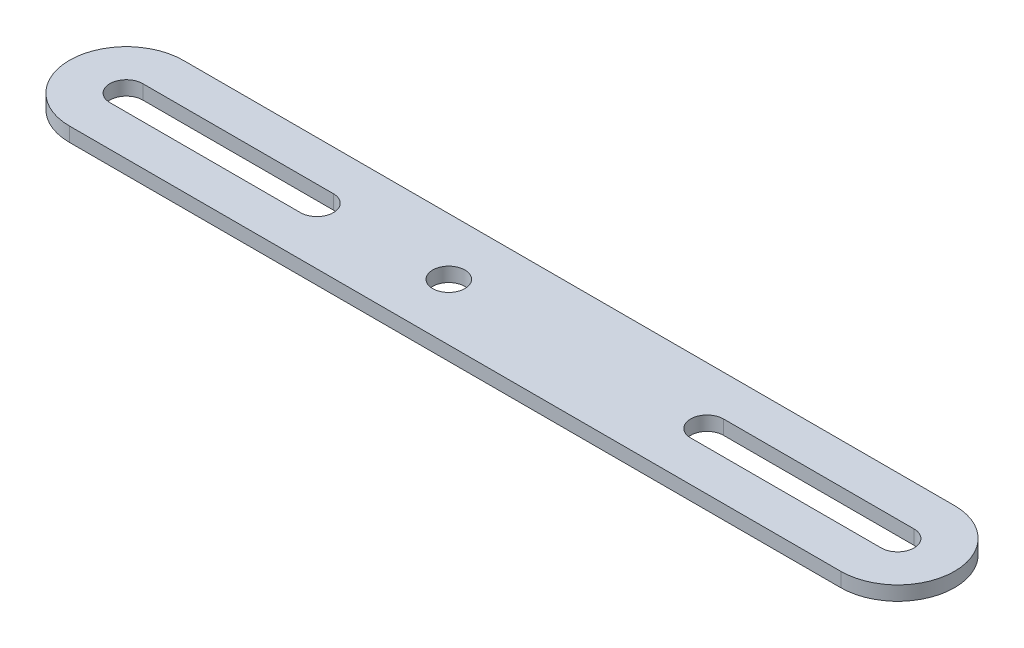
ISO-10303-21;
HEADER;
FILE_DESCRIPTION(('STEP AP214'),'2;1');
FILE_NAME('part.step','',(''),(''),'','','');
FILE_SCHEMA(('AUTOMOTIVE_DESIGN { 1 0 10303 214 1 1 1 1 }'));
ENDSEC;
DATA;
#1=APPLICATION_CONTEXT('core data for automotive mechanical design processes');
#2=APPLICATION_PROTOCOL_DEFINITION('international standard','automotive_design',2000,#1);
#3=PRODUCT_CONTEXT('',#1,'mechanical');
#4=PRODUCT('Part','Part','',(#3));
#5=PRODUCT_RELATED_PRODUCT_CATEGORY('part','',(#4));
#6=PRODUCT_DEFINITION_FORMATION('','',#4);
#7=PRODUCT_DEFINITION_CONTEXT('part definition',#1,'design');
#8=PRODUCT_DEFINITION('design','',#6,#7);
#9=PRODUCT_DEFINITION_SHAPE('','',#8);
#10=(LENGTH_UNIT() NAMED_UNIT(*) SI_UNIT(.MILLI.,.METRE.));
#11=(NAMED_UNIT(*) PLANE_ANGLE_UNIT() SI_UNIT($,.RADIAN.));
#12=(NAMED_UNIT(*) SI_UNIT($,.STERADIAN.) SOLID_ANGLE_UNIT());
#13=UNCERTAINTY_MEASURE_WITH_UNIT(LENGTH_MEASURE(1.E-05),#10,'distance_accuracy_value','');
#14=(GEOMETRIC_REPRESENTATION_CONTEXT(3) GLOBAL_UNCERTAINTY_ASSIGNED_CONTEXT((#13)) GLOBAL_UNIT_ASSIGNED_CONTEXT((#10,
#11,#12)) REPRESENTATION_CONTEXT('',''));
#15=CARTESIAN_POINT('',(0.,0.,0.));
#16=DIRECTION('',(0.,0.,1.));
#17=DIRECTION('',(1.,0.,0.));
#18=AXIS2_PLACEMENT_3D('',#15,#16,#17);
#19=CARTESIAN_POINT('',(-61.,2.25,0.));
#20=DIRECTION('',(0.,1.,0.));
#21=DIRECTION('',(0.,0.,1.));
#22=AXIS2_PLACEMENT_3D('',#19,#20,#21);
#23=PLANE('',#22);
#24=DIRECTION('',(-1.,0.,0.));
#25=VECTOR('',#24,1.);
#26=CARTESIAN_POINT('',(61.,2.25,-2.59999999999998));
#27=LINE('',#26,#25);
#28=CARTESIAN_POINT('',(61.,2.25,-2.59999999999998));
#29=VERTEX_POINT('',#28);
#30=CARTESIAN_POINT('',(30.85,2.25,-2.6));
#31=VERTEX_POINT('',#30);
#32=EDGE_CURVE('E142',#29,#31,#27,.T.);
#33=ORIENTED_EDGE('',*,*,#32,.F.);
#34=CARTESIAN_POINT('',(61.,2.25,0.));
#35=DIRECTION('',(0.,1.,0.));
#36=DIRECTION('',(0.,0.,1.));
#37=AXIS2_PLACEMENT_3D('',#34,#35,#36);
#38=CIRCLE('',#37,2.6);
#39=CARTESIAN_POINT('',(61.,2.25,2.60000000000002));
#40=VERTEX_POINT('',#39);
#41=EDGE_CURVE('E133',#40,#29,#38,.T.);
#42=ORIENTED_EDGE('',*,*,#41,.F.);
#43=DIRECTION('',(1.,0.,0.));
#44=VECTOR('',#43,1.);
#45=CARTESIAN_POINT('',(61.,2.25,2.60000000000002));
#46=LINE('',#45,#44);
#47=CARTESIAN_POINT('',(30.85,2.25,2.60000000000002));
#48=VERTEX_POINT('',#47);
#49=EDGE_CURVE('E160',#48,#40,#46,.T.);
#50=ORIENTED_EDGE('',*,*,#49,.F.);
#51=CARTESIAN_POINT('',(30.85,2.25,0.));
#52=DIRECTION('',(0.,1.,0.));
#53=DIRECTION('',(0.,0.,1.));
#54=AXIS2_PLACEMENT_3D('',#51,#52,#53);
#55=CIRCLE('',#54,2.60000000000002);
#56=EDGE_CURVE('E156',#31,#48,#55,.T.);
#57=ORIENTED_EDGE('',*,*,#56,.F.);
#58=EDGE_LOOP('',(#33,#42,#50,#57));
#59=FACE_BOUND('',#58,.T.);
#60=DIRECTION('',(1.,0.,0.));
#61=VECTOR('',#60,1.);
#62=CARTESIAN_POINT('',(-61.,2.25,2.60000000000002));
#63=LINE('',#62,#61);
#64=CARTESIAN_POINT('',(-61.,2.25,2.60000000000002));
#65=VERTEX_POINT('',#64);
#66=CARTESIAN_POINT('',(-30.85,2.25,2.60000000000005));
#67=VERTEX_POINT('',#66);
#68=EDGE_CURVE('E187',#65,#67,#63,.T.);
#69=ORIENTED_EDGE('',*,*,#68,.F.);
#70=CARTESIAN_POINT('',(-61.,2.25,0.));
#71=DIRECTION('',(0.,1.,0.));
#72=DIRECTION('',(0.,0.,1.));
#73=AXIS2_PLACEMENT_3D('',#70,#71,#72);
#74=CIRCLE('',#73,2.6);
#75=CARTESIAN_POINT('',(-61.,2.25,-2.59999999999998));
#76=VERTEX_POINT('',#75);
#77=EDGE_CURVE('E184',#76,#65,#74,.T.);
#78=ORIENTED_EDGE('',*,*,#77,.F.);
#79=DIRECTION('',(-1.,0.,0.));
#80=VECTOR('',#79,1.);
#81=CARTESIAN_POINT('',(-61.,2.25,-2.59999999999998));
#82=LINE('',#81,#80);
#83=CARTESIAN_POINT('',(-30.85,2.25,-2.60000000000002));
#84=VERTEX_POINT('',#83);
#85=EDGE_CURVE('E195',#84,#76,#82,.T.);
#86=ORIENTED_EDGE('',*,*,#85,.F.);
#87=CARTESIAN_POINT('',(-30.85,2.25,0.));
#88=DIRECTION('',(0.,1.,0.));
#89=DIRECTION('',(0.,0.,1.));
#90=AXIS2_PLACEMENT_3D('',#87,#88,#89);
#91=CIRCLE('',#90,2.60000000000002);
#92=EDGE_CURVE('E191',#67,#84,#91,.T.);
#93=ORIENTED_EDGE('',*,*,#92,.F.);
#94=EDGE_LOOP('',(#69,#78,#86,#93));
#95=FACE_BOUND('',#94,.T.);
#96=CARTESIAN_POINT('',(-61.,2.25,0.));
#97=DIRECTION('',(0.,1.,0.));
#98=DIRECTION('',(0.,0.,1.));
#99=AXIS2_PLACEMENT_3D('',#96,#97,#98);
#100=CIRCLE('',#99,8.99999999999998);
#101=CARTESIAN_POINT('',(-61.,2.25,-8.99999999999998));
#102=VERTEX_POINT('',#101);
#103=CARTESIAN_POINT('',(-61.,2.25,8.99999999999998));
#104=VERTEX_POINT('',#103);
#105=EDGE_CURVE('E227',#102,#104,#100,.T.);
#106=ORIENTED_EDGE('',*,*,#105,.T.);
#107=DIRECTION('',(1.,0.,0.));
#108=VECTOR('',#107,1.);
#109=CARTESIAN_POINT('',(-61.,2.25,8.99999999999998));
#110=LINE('',#109,#108);
#111=CARTESIAN_POINT('',(61.,2.25,9.));
#112=VERTEX_POINT('',#111);
#113=EDGE_CURVE('E231',#104,#112,#110,.T.);
#114=ORIENTED_EDGE('',*,*,#113,.T.);
#115=CARTESIAN_POINT('',(61.,2.25,0.));
#116=DIRECTION('',(0.,1.,0.));
#117=DIRECTION('',(0.,0.,1.));
#118=AXIS2_PLACEMENT_3D('',#115,#116,#117);
#119=CIRCLE('',#118,8.99999999999998);
#120=CARTESIAN_POINT('',(61.,2.25,-8.99999999999998));
#121=VERTEX_POINT('',#120);
#122=EDGE_CURVE('E235',#112,#121,#119,.T.);
#123=ORIENTED_EDGE('',*,*,#122,.T.);
#124=DIRECTION('',(-1.,0.,0.));
#125=VECTOR('',#124,1.);
#126=CARTESIAN_POINT('',(-61.,2.25,-8.99999999999998));
#127=LINE('',#126,#125);
#128=EDGE_CURVE('E238',#121,#102,#127,.T.);
#129=ORIENTED_EDGE('',*,*,#128,.T.);
#130=EDGE_LOOP('',(#106,#114,#123,#129));
#131=FACE_BOUND('',#130,.T.);
#132=CARTESIAN_POINT('',(-10.,2.25,0.));
#133=DIRECTION('',(0.,1.,0.));
#134=DIRECTION('',(0.,0.,1.));
#135=AXIS2_PLACEMENT_3D('',#132,#133,#134);
#136=CIRCLE('',#135,2.55);
#137=CARTESIAN_POINT('',(-10.,2.25,2.55));
#138=VERTEX_POINT('',#137);
#139=EDGE_CURVE('E168',#138,#138,#136,.T.);
#140=ORIENTED_EDGE('',*,*,#139,.F.);
#141=EDGE_LOOP('',(#140));
#142=FACE_BOUND('',#141,.T.);
#143=ADVANCED_FACE('F43',(#59,#95,#131,#142),#23,.T.);
#144=CARTESIAN_POINT('',(-61.,0.,0.));
#145=DIRECTION('',(0.,1.,0.));
#146=DIRECTION('',(0.,0.,1.));
#147=AXIS2_PLACEMENT_3D('',#144,#145,#146);
#148=PLANE('',#147);
#149=CARTESIAN_POINT('',(-61.,0.,0.));
#150=DIRECTION('',(0.,1.,0.));
#151=DIRECTION('',(0.,0.,1.));
#152=AXIS2_PLACEMENT_3D('',#149,#150,#151);
#153=CIRCLE('',#152,2.6);
#154=CARTESIAN_POINT('',(-61.,0.,-2.59999999999998));
#155=VERTEX_POINT('',#154);
#156=CARTESIAN_POINT('',(-61.,0.,2.60000000000002));
#157=VERTEX_POINT('',#156);
#158=EDGE_CURVE('E151',#155,#157,#153,.T.);
#159=ORIENTED_EDGE('',*,*,#158,.T.);
#160=DIRECTION('',(1.,0.,0.));
#161=VECTOR('',#160,1.);
#162=CARTESIAN_POINT('',(-61.,0.,2.60000000000002));
#163=LINE('',#162,#161);
#164=CARTESIAN_POINT('',(-30.85,0.,2.60000000000005));
#165=VERTEX_POINT('',#164);
#166=EDGE_CURVE('E202',#157,#165,#163,.T.);
#167=ORIENTED_EDGE('',*,*,#166,.T.);
#168=CARTESIAN_POINT('',(-30.85,0.,0.));
#169=DIRECTION('',(0.,1.,0.));
#170=DIRECTION('',(0.,0.,1.));
#171=AXIS2_PLACEMENT_3D('',#168,#169,#170);
#172=CIRCLE('',#171,2.60000000000002);
#173=CARTESIAN_POINT('',(-30.85,0.,-2.60000000000002));
#174=VERTEX_POINT('',#173);
#175=EDGE_CURVE('E206',#165,#174,#172,.T.);
#176=ORIENTED_EDGE('',*,*,#175,.T.);
#177=DIRECTION('',(-1.,0.,0.));
#178=VECTOR('',#177,1.);
#179=CARTESIAN_POINT('',(-61.,0.,-2.59999999999998));
#180=LINE('',#179,#178);
#181=EDGE_CURVE('E188',#174,#155,#180,.T.);
#182=ORIENTED_EDGE('',*,*,#181,.T.);
#183=EDGE_LOOP('',(#159,#167,#176,#182));
#184=FACE_BOUND('',#183,.T.);
#185=CARTESIAN_POINT('',(-61.,0.,0.));
#186=DIRECTION('',(0.,1.,0.));
#187=DIRECTION('',(0.,0.,1.));
#188=AXIS2_PLACEMENT_3D('',#185,#186,#187);
#189=CIRCLE('',#188,8.99999999999998);
#190=CARTESIAN_POINT('',(-61.,0.,-8.99999999999998));
#191=VERTEX_POINT('',#190);
#192=CARTESIAN_POINT('',(-61.,0.,8.99999999999998));
#193=VERTEX_POINT('',#192);
#194=EDGE_CURVE('E226',#191,#193,#189,.T.);
#195=ORIENTED_EDGE('',*,*,#194,.F.);
#196=DIRECTION('',(-1.,0.,0.));
#197=VECTOR('',#196,1.);
#198=CARTESIAN_POINT('',(-61.,0.,-8.99999999999998));
#199=LINE('',#198,#197);
#200=CARTESIAN_POINT('',(61.,0.,-8.99999999999998));
#201=VERTEX_POINT('',#200);
#202=EDGE_CURVE('E232',#201,#191,#199,.T.);
#203=ORIENTED_EDGE('',*,*,#202,.F.);
#204=CARTESIAN_POINT('',(61.,0.,0.));
#205=DIRECTION('',(0.,1.,0.));
#206=DIRECTION('',(0.,0.,1.));
#207=AXIS2_PLACEMENT_3D('',#204,#205,#206);
#208=CIRCLE('',#207,8.99999999999998);
#209=CARTESIAN_POINT('',(61.,0.,9.));
#210=VERTEX_POINT('',#209);
#211=EDGE_CURVE('E248',#210,#201,#208,.T.);
#212=ORIENTED_EDGE('',*,*,#211,.F.);
#213=DIRECTION('',(1.,0.,0.));
#214=VECTOR('',#213,1.);
#215=CARTESIAN_POINT('',(-61.,0.,8.99999999999998));
#216=LINE('',#215,#214);
#217=EDGE_CURVE('E245',#193,#210,#216,.T.);
#218=ORIENTED_EDGE('',*,*,#217,.F.);
#219=EDGE_LOOP('',(#195,#203,#212,#218));
#220=FACE_BOUND('',#219,.T.);
#221=CARTESIAN_POINT('',(61.,0.,0.));
#222=DIRECTION('',(0.,1.,0.));
#223=DIRECTION('',(0.,0.,1.));
#224=AXIS2_PLACEMENT_3D('',#221,#222,#223);
#225=CIRCLE('',#224,2.6);
#226=CARTESIAN_POINT('',(61.,0.,2.60000000000002));
#227=VERTEX_POINT('',#226);
#228=CARTESIAN_POINT('',(61.,0.,-2.59999999999998));
#229=VERTEX_POINT('',#228);
#230=EDGE_CURVE('E67',#227,#229,#225,.T.);
#231=ORIENTED_EDGE('',*,*,#230,.T.);
#232=DIRECTION('',(-1.,0.,0.));
#233=VECTOR('',#232,1.);
#234=CARTESIAN_POINT('',(61.,0.,-2.59999999999998));
#235=LINE('',#234,#233);
#236=CARTESIAN_POINT('',(30.85,0.,-2.6));
#237=VERTEX_POINT('',#236);
#238=EDGE_CURVE('E149',#229,#237,#235,.T.);
#239=ORIENTED_EDGE('',*,*,#238,.T.);
#240=CARTESIAN_POINT('',(30.85,0.,0.));
#241=DIRECTION('',(0.,1.,0.));
#242=DIRECTION('',(0.,0.,1.));
#243=AXIS2_PLACEMENT_3D('',#240,#241,#242);
#244=CIRCLE('',#243,2.60000000000002);
#245=CARTESIAN_POINT('',(30.85,0.,2.60000000000002));
#246=VERTEX_POINT('',#245);
#247=EDGE_CURVE('E171',#237,#246,#244,.T.);
#248=ORIENTED_EDGE('',*,*,#247,.T.);
#249=DIRECTION('',(1.,0.,0.));
#250=VECTOR('',#249,1.);
#251=CARTESIAN_POINT('',(61.,0.,2.60000000000002));
#252=LINE('',#251,#250);
#253=EDGE_CURVE('E143',#246,#227,#252,.T.);
#254=ORIENTED_EDGE('',*,*,#253,.T.);
#255=EDGE_LOOP('',(#231,#239,#248,#254));
#256=FACE_BOUND('',#255,.T.);
#257=CARTESIAN_POINT('',(-10.,0.,0.));
#258=DIRECTION('',(0.,1.,0.));
#259=DIRECTION('',(0.,0.,1.));
#260=AXIS2_PLACEMENT_3D('',#257,#258,#259);
#261=CIRCLE('',#260,2.55);
#262=CARTESIAN_POINT('',(-10.,0.,2.55));
#263=VERTEX_POINT('',#262);
#264=EDGE_CURVE('E351',#263,#263,#261,.T.);
#265=ORIENTED_EDGE('',*,*,#264,.T.);
#266=EDGE_LOOP('',(#265));
#267=FACE_BOUND('',#266,.T.);
#268=ADVANCED_FACE('F271',(#184,#220,#256,#267),#148,.F.);
#269=CARTESIAN_POINT('',(-61.,2.25,0.));
#270=DIRECTION('',(0.,-1.,0.));
#271=DIRECTION('',(0.,0.,-1.));
#272=AXIS2_PLACEMENT_3D('',#269,#270,#271);
#273=CYLINDRICAL_SURFACE('',#272,8.99999999999998);
#274=ORIENTED_EDGE('',*,*,#194,.T.);
#275=DIRECTION('',(0.,-1.,0.));
#276=VECTOR('',#275,1.);
#277=CARTESIAN_POINT('',(-61.,2.25,8.99999999999998));
#278=LINE('',#277,#276);
#279=EDGE_CURVE('E11',#104,#193,#278,.T.);
#280=ORIENTED_EDGE('',*,*,#279,.F.);
#281=ORIENTED_EDGE('',*,*,#105,.F.);
#282=DIRECTION('',(0.,-1.,0.));
#283=VECTOR('',#282,1.);
#284=CARTESIAN_POINT('',(-61.,2.25,-8.99999999999998));
#285=LINE('',#284,#283);
#286=EDGE_CURVE('E241',#102,#191,#285,.T.);
#287=ORIENTED_EDGE('',*,*,#286,.T.);
#288=EDGE_LOOP('',(#274,#280,#281,#287));
#289=FACE_BOUND('',#288,.T.);
#290=ADVANCED_FACE('F45',(#289),#273,.T.);
#291=CARTESIAN_POINT('',(-61.,2.25,8.99999999999998));
#292=DIRECTION('',(0.,0.,-1.));
#293=DIRECTION('',(-1.,0.,0.));
#294=AXIS2_PLACEMENT_3D('',#291,#292,#293);
#295=PLANE('',#294);
#296=ORIENTED_EDGE('',*,*,#217,.T.);
#297=DIRECTION('',(0.,-1.,0.));
#298=VECTOR('',#297,1.);
#299=CARTESIAN_POINT('',(61.,2.25,9.));
#300=LINE('',#299,#298);
#301=EDGE_CURVE('E52',#112,#210,#300,.T.);
#302=ORIENTED_EDGE('',*,*,#301,.F.);
#303=ORIENTED_EDGE('',*,*,#113,.F.);
#304=ORIENTED_EDGE('',*,*,#279,.T.);
#305=EDGE_LOOP('',(#296,#302,#303,#304));
#306=FACE_BOUND('',#305,.T.);
#307=ADVANCED_FACE('F282',(#306),#295,.F.);
#308=CARTESIAN_POINT('',(61.,2.25,0.));
#309=DIRECTION('',(0.,-1.,0.));
#310=DIRECTION('',(0.,0.,-1.));
#311=AXIS2_PLACEMENT_3D('',#308,#309,#310);
#312=CYLINDRICAL_SURFACE('',#311,8.99999999999998);
#313=ORIENTED_EDGE('',*,*,#211,.T.);
#314=DIRECTION('',(0.,-1.,0.));
#315=VECTOR('',#314,1.);
#316=CARTESIAN_POINT('',(61.,2.25,-8.99999999999998));
#317=LINE('',#316,#315);
#318=EDGE_CURVE('E256',#121,#201,#317,.T.);
#319=ORIENTED_EDGE('',*,*,#318,.F.);
#320=ORIENTED_EDGE('',*,*,#122,.F.);
#321=ORIENTED_EDGE('',*,*,#301,.T.);
#322=EDGE_LOOP('',(#313,#319,#320,#321));
#323=FACE_BOUND('',#322,.T.);
#324=ADVANCED_FACE('F265',(#323),#312,.T.);
#325=CARTESIAN_POINT('',(-61.,2.25,-8.99999999999998));
#326=DIRECTION('',(0.,0.,1.));
#327=DIRECTION('',(1.,0.,0.));
#328=AXIS2_PLACEMENT_3D('',#325,#326,#327);
#329=PLANE('',#328);
#330=ORIENTED_EDGE('',*,*,#202,.T.);
#331=ORIENTED_EDGE('',*,*,#286,.F.);
#332=ORIENTED_EDGE('',*,*,#128,.F.);
#333=ORIENTED_EDGE('',*,*,#318,.T.);
#334=EDGE_LOOP('',(#330,#331,#332,#333));
#335=FACE_BOUND('',#334,.T.);
#336=ADVANCED_FACE('F275',(#335),#329,.F.);
#337=CARTESIAN_POINT('',(-61.,2.25,0.));
#338=DIRECTION('',(0.,-1.,0.));
#339=DIRECTION('',(0.,0.,-1.));
#340=AXIS2_PLACEMENT_3D('',#337,#338,#339);
#341=CYLINDRICAL_SURFACE('',#340,2.6);
#342=ORIENTED_EDGE('',*,*,#158,.F.);
#343=DIRECTION('',(0.,-1.,0.));
#344=VECTOR('',#343,1.);
#345=CARTESIAN_POINT('',(-61.,2.25,-2.59999999999998));
#346=LINE('',#345,#344);
#347=EDGE_CURVE('E198',#76,#155,#346,.T.);
#348=ORIENTED_EDGE('',*,*,#347,.F.);
#349=ORIENTED_EDGE('',*,*,#77,.T.);
#350=DIRECTION('',(0.,-1.,0.));
#351=VECTOR('',#350,1.);
#352=CARTESIAN_POINT('',(-61.,2.25,2.60000000000002));
#353=LINE('',#352,#351);
#354=EDGE_CURVE('E222',#65,#157,#353,.T.);
#355=ORIENTED_EDGE('',*,*,#354,.T.);
#356=EDGE_LOOP('',(#342,#348,#349,#355));
#357=FACE_BOUND('',#356,.T.);
#358=ADVANCED_FACE('F297',(#357),#341,.F.);
#359=CARTESIAN_POINT('',(-61.,2.25,2.60000000000002));
#360=DIRECTION('',(0.,0.,-1.));
#361=DIRECTION('',(-1.,0.,0.));
#362=AXIS2_PLACEMENT_3D('',#359,#360,#361);
#363=PLANE('',#362);
#364=ORIENTED_EDGE('',*,*,#166,.F.);
#365=ORIENTED_EDGE('',*,*,#354,.F.);
#366=ORIENTED_EDGE('',*,*,#68,.T.);
#367=DIRECTION('',(0.,-1.,0.));
#368=VECTOR('',#367,1.);
#369=CARTESIAN_POINT('',(-30.85,2.25,2.60000000000005));
#370=LINE('',#369,#368);
#371=EDGE_CURVE('E219',#67,#165,#370,.T.);
#372=ORIENTED_EDGE('',*,*,#371,.T.);
#373=EDGE_LOOP('',(#364,#365,#366,#372));
#374=FACE_BOUND('',#373,.T.);
#375=ADVANCED_FACE('F304',(#374),#363,.T.);
#376=CARTESIAN_POINT('',(-30.85,2.25,0.));
#377=DIRECTION('',(0.,-1.,0.));
#378=DIRECTION('',(0.,0.,-1.));
#379=AXIS2_PLACEMENT_3D('',#376,#377,#378);
#380=CYLINDRICAL_SURFACE('',#379,2.60000000000002);
#381=ORIENTED_EDGE('',*,*,#175,.F.);
#382=ORIENTED_EDGE('',*,*,#371,.F.);
#383=ORIENTED_EDGE('',*,*,#92,.T.);
#384=DIRECTION('',(0.,-1.,0.));
#385=VECTOR('',#384,1.);
#386=CARTESIAN_POINT('',(-30.85,2.25,-2.60000000000002));
#387=LINE('',#386,#385);
#388=EDGE_CURVE('E216',#84,#174,#387,.T.);
#389=ORIENTED_EDGE('',*,*,#388,.T.);
#390=EDGE_LOOP('',(#381,#382,#383,#389));
#391=FACE_BOUND('',#390,.T.);
#392=ADVANCED_FACE('F309',(#391),#380,.F.);
#393=CARTESIAN_POINT('',(-61.,2.25,-2.59999999999998));
#394=DIRECTION('',(0.,0.,1.));
#395=DIRECTION('',(1.,0.,0.));
#396=AXIS2_PLACEMENT_3D('',#393,#394,#395);
#397=PLANE('',#396);
#398=ORIENTED_EDGE('',*,*,#181,.F.);
#399=ORIENTED_EDGE('',*,*,#388,.F.);
#400=ORIENTED_EDGE('',*,*,#85,.T.);
#401=ORIENTED_EDGE('',*,*,#347,.T.);
#402=EDGE_LOOP('',(#398,#399,#400,#401));
#403=FACE_BOUND('',#402,.T.);
#404=ADVANCED_FACE('F316',(#403),#397,.T.);
#405=CARTESIAN_POINT('',(61.,2.25,0.));
#406=DIRECTION('',(0.,-1.,0.));
#407=DIRECTION('',(0.,0.,-1.));
#408=AXIS2_PLACEMENT_3D('',#405,#406,#407);
#409=CYLINDRICAL_SURFACE('',#408,2.6);
#410=ORIENTED_EDGE('',*,*,#230,.F.);
#411=DIRECTION('',(0.,-1.,0.));
#412=VECTOR('',#411,1.);
#413=CARTESIAN_POINT('',(61.,2.25,2.60000000000002));
#414=LINE('',#413,#412);
#415=EDGE_CURVE('E137',#40,#227,#414,.T.);
#416=ORIENTED_EDGE('',*,*,#415,.F.);
#417=ORIENTED_EDGE('',*,*,#41,.T.);
#418=DIRECTION('',(0.,-1.,0.));
#419=VECTOR('',#418,1.);
#420=CARTESIAN_POINT('',(61.,2.25,-2.59999999999998));
#421=LINE('',#420,#419);
#422=EDGE_CURVE('E136',#29,#229,#421,.T.);
#423=ORIENTED_EDGE('',*,*,#422,.T.);
#424=EDGE_LOOP('',(#410,#416,#417,#423));
#425=FACE_BOUND('',#424,.T.);
#426=ADVANCED_FACE('F135',(#425),#409,.F.);
#427=CARTESIAN_POINT('',(61.,2.25,-2.59999999999998));
#428=DIRECTION('',(0.,0.,1.));
#429=DIRECTION('',(1.,0.,0.));
#430=AXIS2_PLACEMENT_3D('',#427,#428,#429);
#431=PLANE('',#430);
#432=ORIENTED_EDGE('',*,*,#238,.F.);
#433=ORIENTED_EDGE('',*,*,#422,.F.);
#434=ORIENTED_EDGE('',*,*,#32,.T.);
#435=DIRECTION('',(0.,-1.,0.));
#436=VECTOR('',#435,1.);
#437=CARTESIAN_POINT('',(30.85,2.25,-2.6));
#438=LINE('',#437,#436);
#439=EDGE_CURVE('E152',#31,#237,#438,.T.);
#440=ORIENTED_EDGE('',*,*,#439,.T.);
#441=EDGE_LOOP('',(#432,#433,#434,#440));
#442=FACE_BOUND('',#441,.T.);
#443=ADVANCED_FACE('F146',(#442),#431,.T.);
#444=CARTESIAN_POINT('',(30.85,2.25,0.));
#445=DIRECTION('',(0.,-1.,0.));
#446=DIRECTION('',(0.,0.,-1.));
#447=AXIS2_PLACEMENT_3D('',#444,#445,#446);
#448=CYLINDRICAL_SURFACE('',#447,2.60000000000002);
#449=ORIENTED_EDGE('',*,*,#247,.F.);
#450=ORIENTED_EDGE('',*,*,#439,.F.);
#451=ORIENTED_EDGE('',*,*,#56,.T.);
#452=DIRECTION('',(0.,-1.,0.));
#453=VECTOR('',#452,1.);
#454=CARTESIAN_POINT('',(30.85,2.25,2.60000000000002));
#455=LINE('',#454,#453);
#456=EDGE_CURVE('E59',#48,#246,#455,.T.);
#457=ORIENTED_EDGE('',*,*,#456,.T.);
#458=EDGE_LOOP('',(#449,#450,#451,#457));
#459=FACE_BOUND('',#458,.T.);
#460=ADVANCED_FACE('F334',(#459),#448,.F.);
#461=CARTESIAN_POINT('',(61.,2.25,2.60000000000002));
#462=DIRECTION('',(0.,0.,-1.));
#463=DIRECTION('',(-1.,0.,0.));
#464=AXIS2_PLACEMENT_3D('',#461,#462,#463);
#465=PLANE('',#464);
#466=ORIENTED_EDGE('',*,*,#253,.F.);
#467=ORIENTED_EDGE('',*,*,#456,.F.);
#468=ORIENTED_EDGE('',*,*,#49,.T.);
#469=ORIENTED_EDGE('',*,*,#415,.T.);
#470=EDGE_LOOP('',(#466,#467,#468,#469));
#471=FACE_BOUND('',#470,.T.);
#472=ADVANCED_FACE('F337',(#471),#465,.T.);
#473=CARTESIAN_POINT('',(-10.,2.25,0.));
#474=DIRECTION('',(0.,-1.,0.));
#475=DIRECTION('',(0.,0.,-1.));
#476=AXIS2_PLACEMENT_3D('',#473,#474,#475);
#477=CYLINDRICAL_SURFACE('',#476,2.55);
#478=ORIENTED_EDGE('',*,*,#139,.T.);
#479=EDGE_LOOP('',(#478));
#480=FACE_BOUND('',#479,.T.);
#481=ORIENTED_EDGE('',*,*,#264,.F.);
#482=EDGE_LOOP('',(#481));
#483=FACE_BOUND('',#482,.T.);
#484=ADVANCED_FACE('F341',(#480,#483),#477,.F.);
#485=CLOSED_SHELL('',(#143,#268,#290,#307,#324,#336,#358,#375,#392,#404,#426,#443,#460,#472,#484));
#486=MANIFOLD_SOLID_BREP('B2',#485);
#487=ADVANCED_BREP_SHAPE_REPRESENTATION('',(#18,#486),#14);
#488=SHAPE_DEFINITION_REPRESENTATION(#9,#487);
ENDSEC;
END-ISO-10303-21;
